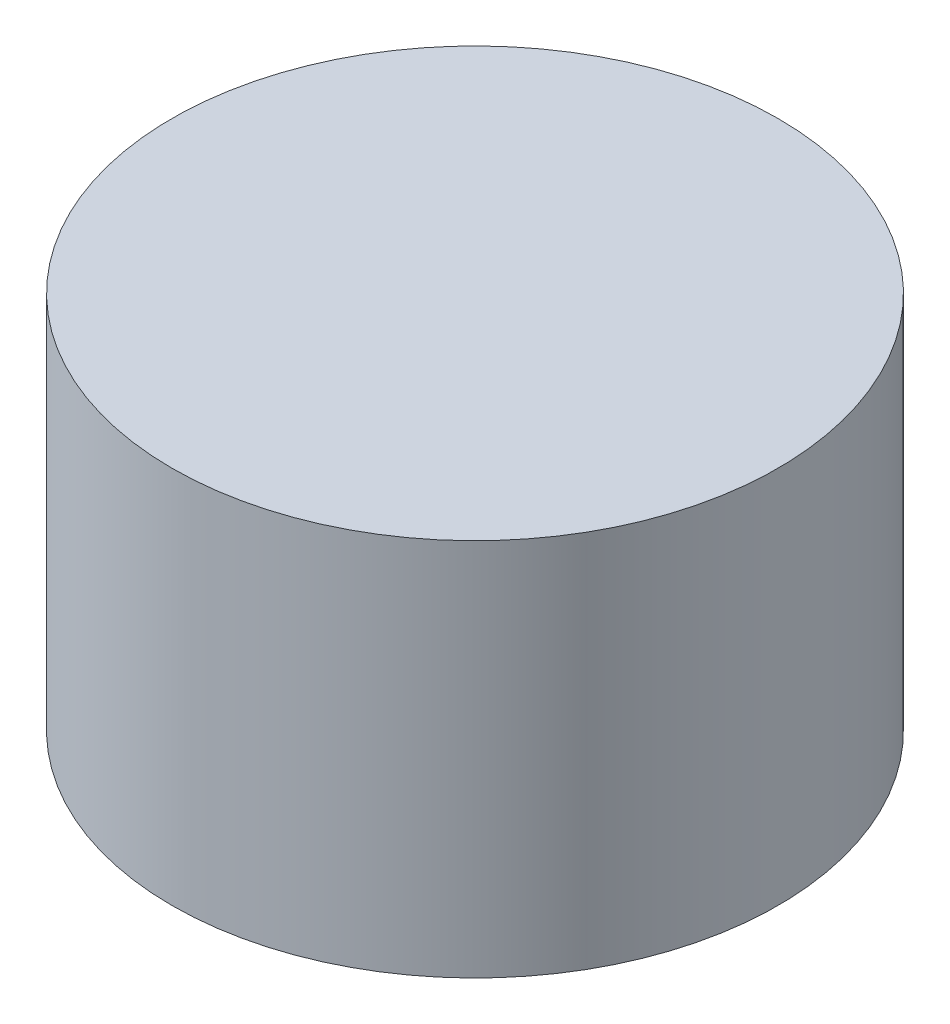
ISO-10303-21;
HEADER;
FILE_DESCRIPTION(('STEP AP214'),'2;1');
FILE_NAME('part.step','',(''),(''),'','','');
FILE_SCHEMA(('AUTOMOTIVE_DESIGN { 1 0 10303 214 1 1 1 1 }'));
ENDSEC;
DATA;
#1=APPLICATION_CONTEXT('core data for automotive mechanical design processes');
#2=APPLICATION_PROTOCOL_DEFINITION('international standard','automotive_design',2000,#1);
#3=PRODUCT_CONTEXT('',#1,'mechanical');
#4=PRODUCT('Part','Part','',(#3));
#5=PRODUCT_RELATED_PRODUCT_CATEGORY('part','',(#4));
#6=PRODUCT_DEFINITION_FORMATION('','',#4);
#7=PRODUCT_DEFINITION_CONTEXT('part definition',#1,'design');
#8=PRODUCT_DEFINITION('design','',#6,#7);
#9=PRODUCT_DEFINITION_SHAPE('','',#8);
#10=(LENGTH_UNIT() NAMED_UNIT(*) SI_UNIT(.MILLI.,.METRE.));
#11=(NAMED_UNIT(*) PLANE_ANGLE_UNIT() SI_UNIT($,.RADIAN.));
#12=(NAMED_UNIT(*) SI_UNIT($,.STERADIAN.) SOLID_ANGLE_UNIT());
#13=UNCERTAINTY_MEASURE_WITH_UNIT(LENGTH_MEASURE(1.E-05),#10,'distance_accuracy_value','');
#14=(GEOMETRIC_REPRESENTATION_CONTEXT(3) GLOBAL_UNCERTAINTY_ASSIGNED_CONTEXT((#13)) GLOBAL_UNIT_ASSIGNED_CONTEXT((#10,
#11,#12)) REPRESENTATION_CONTEXT('',''));
#15=CARTESIAN_POINT('',(0.,0.,0.));
#16=DIRECTION('',(0.,0.,1.));
#17=DIRECTION('',(1.,0.,0.));
#18=AXIS2_PLACEMENT_3D('',#15,#16,#17);
#19=CARTESIAN_POINT('',(0.,25.4,0.));
#20=DIRECTION('',(0.,-1.,0.));
#21=DIRECTION('',(0.,0.,-1.));
#22=AXIS2_PLACEMENT_3D('',#19,#20,#21);
#23=CYLINDRICAL_SURFACE('',#22,20.32);
#24=CARTESIAN_POINT('',(0.,25.4,0.));
#25=DIRECTION('',(0.,1.,0.));
#26=DIRECTION('',(0.,0.,1.));
#27=AXIS2_PLACEMENT_3D('',#24,#25,#26);
#28=CIRCLE('',#27,20.32);
#29=CARTESIAN_POINT('',(0.,25.4,20.32));
#30=VERTEX_POINT('',#29);
#31=EDGE_CURVE('E10',#30,#30,#28,.T.);
#32=ORIENTED_EDGE('',*,*,#31,.F.);
#33=EDGE_LOOP('',(#32));
#34=FACE_BOUND('',#33,.T.);
#35=CARTESIAN_POINT('',(0.,0.,0.));
#36=DIRECTION('',(0.,1.,0.));
#37=DIRECTION('',(0.,0.,1.));
#38=AXIS2_PLACEMENT_3D('',#35,#36,#37);
#39=CIRCLE('',#38,20.32);
#40=CARTESIAN_POINT('',(0.,0.,20.32));
#41=VERTEX_POINT('',#40);
#42=EDGE_CURVE('E48',#41,#41,#39,.T.);
#43=ORIENTED_EDGE('',*,*,#42,.T.);
#44=EDGE_LOOP('',(#43));
#45=FACE_BOUND('',#44,.T.);
#46=ADVANCED_FACE('F44',(#34,#45),#23,.T.);
#47=CARTESIAN_POINT('',(0.,25.4,0.));
#48=DIRECTION('',(0.,1.,0.));
#49=DIRECTION('',(0.,0.,1.));
#50=AXIS2_PLACEMENT_3D('',#47,#48,#49);
#51=PLANE('',#50);
#52=ORIENTED_EDGE('',*,*,#31,.T.);
#53=EDGE_LOOP('',(#52));
#54=FACE_BOUND('',#53,.T.);
#55=ADVANCED_FACE('F58',(#54),#51,.T.);
#56=CARTESIAN_POINT('',(0.,0.,0.));
#57=DIRECTION('',(0.,1.,0.));
#58=DIRECTION('',(0.,0.,1.));
#59=AXIS2_PLACEMENT_3D('',#56,#57,#58);
#60=PLANE('',#59);
#61=ORIENTED_EDGE('',*,*,#42,.F.);
#62=EDGE_LOOP('',(#61));
#63=FACE_BOUND('',#62,.T.);
#64=ADVANCED_FACE('F59',(#63),#60,.F.);
#65=CLOSED_SHELL('',(#46,#55,#64));
#66=MANIFOLD_SOLID_BREP('B2',#65);
#67=ADVANCED_BREP_SHAPE_REPRESENTATION('',(#18,#66),#14);
#68=SHAPE_DEFINITION_REPRESENTATION(#9,#67);
ENDSEC;
END-ISO-10303-21;
